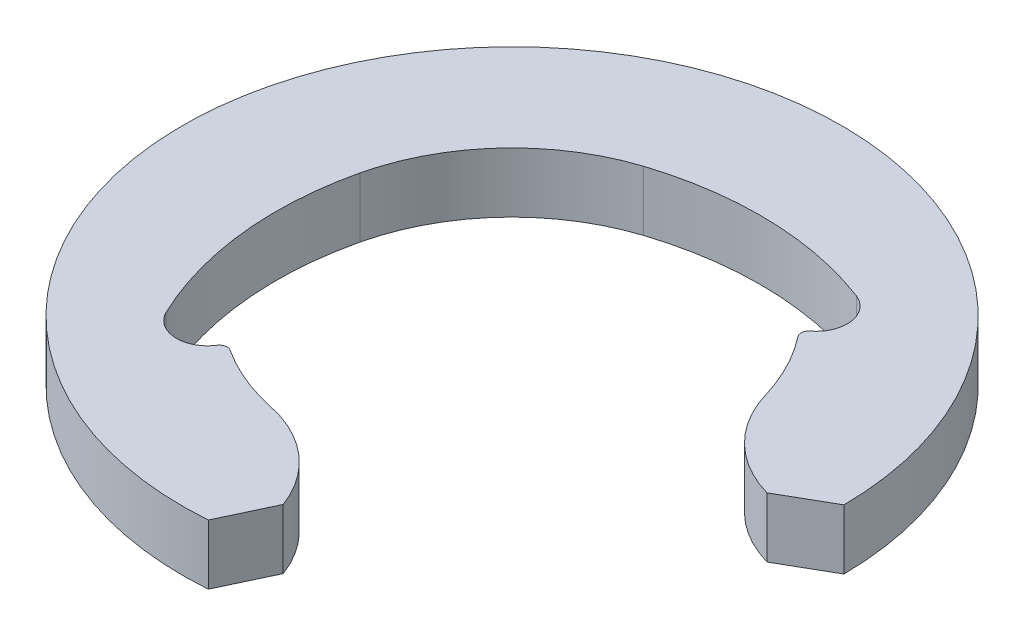
ISO-10303-21;
HEADER;
FILE_DESCRIPTION(('STEP AP214'),'2;1');
FILE_NAME('part.step','',(''),(''),'','','');
FILE_SCHEMA(('AUTOMOTIVE_DESIGN { 1 0 10303 214 1 1 1 1 }'));
ENDSEC;
DATA;
#1=APPLICATION_CONTEXT('core data for automotive mechanical design processes');
#2=APPLICATION_PROTOCOL_DEFINITION('international standard','automotive_design',2000,#1);
#3=PRODUCT_CONTEXT('',#1,'mechanical');
#4=PRODUCT('Part','Part','',(#3));
#5=PRODUCT_RELATED_PRODUCT_CATEGORY('part','',(#4));
#6=PRODUCT_DEFINITION_FORMATION('','',#4);
#7=PRODUCT_DEFINITION_CONTEXT('part definition',#1,'design');
#8=PRODUCT_DEFINITION('design','',#6,#7);
#9=PRODUCT_DEFINITION_SHAPE('','',#8);
#10=(LENGTH_UNIT() NAMED_UNIT(*) SI_UNIT(.MILLI.,.METRE.));
#11=(NAMED_UNIT(*) PLANE_ANGLE_UNIT() SI_UNIT($,.RADIAN.));
#12=(NAMED_UNIT(*) SI_UNIT($,.STERADIAN.) SOLID_ANGLE_UNIT());
#13=UNCERTAINTY_MEASURE_WITH_UNIT(LENGTH_MEASURE(1.E-05),#10,'distance_accuracy_value','');
#14=(GEOMETRIC_REPRESENTATION_CONTEXT(3) GLOBAL_UNCERTAINTY_ASSIGNED_CONTEXT((#13)) GLOBAL_UNIT_ASSIGNED_CONTEXT((#10,
#11,#12)) REPRESENTATION_CONTEXT('',''));
#15=CARTESIAN_POINT('',(0.,0.,0.));
#16=DIRECTION('',(0.,0.,1.));
#17=DIRECTION('',(1.,0.,0.));
#18=AXIS2_PLACEMENT_3D('',#15,#16,#17);
#19=CARTESIAN_POINT('',(1.06152361243118,-8.0264,-0.825318360032846));
#20=DIRECTION('',(0.,-1.,0.));
#21=DIRECTION('',(0.,0.,-1.));
#22=AXIS2_PLACEMENT_3D('',#19,#20,#21);
#23=PLANE('',#22);
#24=CARTESIAN_POINT('',(0.,-8.0264,0.));
#25=DIRECTION('',(0.,1.,0.));
#26=DIRECTION('',(0.,0.,1.));
#27=AXIS2_PLACEMENT_3D('',#24,#25,#26);
#28=CIRCLE('',#27,1.2954);
#29=CARTESIAN_POINT('',(1.2414363720262,-8.0264,-0.369995802963264));
#30=VERTEX_POINT('',#29);
#31=CARTESIAN_POINT('',(1.02267209887113,-8.0264,-0.795111902936013));
#32=VERTEX_POINT('',#31);
#33=EDGE_CURVE('E122',#30,#32,#28,.T.);
#34=ORIENTED_EDGE('',*,*,#33,.F.);
#35=CARTESIAN_POINT('',(1.99603495110095,-8.0264,-0.594895212607599));
#36=DIRECTION('',(0.,1.,0.));
#37=DIRECTION('',(0.,0.,1.));
#38=AXIS2_PLACEMENT_3D('',#35,#36,#37);
#39=CIRCLE('',#38,0.7874);
#40=CARTESIAN_POINT('',(1.78508296449176,-8.0264,0.163720644955132));
#41=VERTEX_POINT('',#40);
#42=EDGE_CURVE('E20',#41,#30,#39,.F.);
#43=ORIENTED_EDGE('',*,*,#42,.F.);
#44=DIRECTION('',(-0.867166283714379,0.,0.498018710882426));
#45=VECTOR('',#44,1.);
#46=CARTESIAN_POINT('',(2.09544966076299,-8.0264,-0.0145247791125125));
#47=LINE('',#46,#45);
#48=CARTESIAN_POINT('',(2.09544966076299,-8.0264,-0.0145247791125123));
#49=VERTEX_POINT('',#48);
#50=EDGE_CURVE('E115',#49,#41,#47,.T.);
#51=ORIENTED_EDGE('',*,*,#50,.F.);
#52=CARTESIAN_POINT('',(0.,-8.0264,0.));
#53=DIRECTION('',(0.,1.,0.));
#54=DIRECTION('',(0.,0.,1.));
#55=AXIS2_PLACEMENT_3D('',#52,#53,#54);
#56=CIRCLE('',#55,2.0955);
#57=CARTESIAN_POINT('',(0.15860830570357,-8.0264,2.08948885026024));
#58=VERTEX_POINT('',#57);
#59=EDGE_CURVE('E164',#58,#49,#56,.F.);
#60=ORIENTED_EDGE('',*,*,#59,.F.);
#61=DIRECTION('',(-0.424689236619047,0.,0.905339191850177));
#62=VECTOR('',#61,1.);
#63=CARTESIAN_POINT('',(0.310608444300769,-8.0264,1.76545972314077));
#64=LINE('',#63,#62);
#65=CARTESIAN_POINT('',(0.31060844430077,-8.0264,1.76545972314077));
#66=VERTEX_POINT('',#65);
#67=EDGE_CURVE('E168',#58,#66,#64,.F.);
#68=ORIENTED_EDGE('',*,*,#67,.T.);
#69=CARTESIAN_POINT('',(-0.427990513192639,-8.0264,2.03835226607598));
#70=DIRECTION('',(0.,1.,0.));
#71=DIRECTION('',(0.,0.,1.));
#72=AXIS2_PLACEMENT_3D('',#69,#70,#71);
#73=CIRCLE('',#72,0.7874);
#74=CARTESIAN_POINT('',(-0.266189221619812,-8.0264,1.2677556776814));
#75=VERTEX_POINT('',#74);
#76=EDGE_CURVE('E160',#75,#66,#73,.F.);
#77=ORIENTED_EDGE('',*,*,#76,.F.);
#78=CARTESIAN_POINT('',(0.,-8.0264,0.));
#79=DIRECTION('',(0.,1.,0.));
#80=DIRECTION('',(0.,0.,1.));
#81=AXIS2_PLACEMENT_3D('',#78,#79,#80);
#82=CIRCLE('',#81,1.2954);
#83=CARTESIAN_POINT('',(-0.707922475341271,-8.0264,1.08485341355719));
#84=VERTEX_POINT('',#83);
#85=EDGE_CURVE('E157',#75,#84,#82,.F.);
#86=ORIENTED_EDGE('',*,*,#85,.T.);
#87=CARTESIAN_POINT('',(-0.734816588987815,-8.0264,1.12606720745458));
#88=DIRECTION('',(0.,1.,0.));
#89=DIRECTION('',(0.,0.,1.));
#90=AXIS2_PLACEMENT_3D('',#87,#88,#89);
#91=CIRCLE('',#90,0.0492125);
#92=CARTESIAN_POINT('',(-0.77634065452485,-8.0264,1.0996546699482));
#93=VERTEX_POINT('',#92);
#94=EDGE_CURVE('E154',#93,#84,#91,.F.);
#95=ORIENTED_EDGE('',*,*,#94,.F.);
#96=CARTESIAN_POINT('',(-0.942436916672991,-8.0264,0.994004519922681));
#97=DIRECTION('',(0.,1.,0.));
#98=DIRECTION('',(0.,0.,1.));
#99=AXIS2_PLACEMENT_3D('',#96,#97,#98);
#100=CIRCLE('',#99,0.19685);
#101=CARTESIAN_POINT('',(-1.1199557561236,-8.0264,1.07907498565614));
#102=VERTEX_POINT('',#101);
#103=EDGE_CURVE('E151',#93,#102,#100,.F.);
#104=ORIENTED_EDGE('',*,*,#103,.T.);
#105=CARTESIAN_POINT('',(0.769760921899024,-8.0264,0.173486156880563));
#106=DIRECTION('',(0.,1.,0.));
#107=DIRECTION('',(0.,0.,1.));
#108=AXIS2_PLACEMENT_3D('',#105,#106,#107);
#109=CIRCLE('',#108,2.0955);
#110=CARTESIAN_POINT('',(-1.27075139620216,-8.0264,-0.303409774825023));
#111=VERTEX_POINT('',#110);
#112=EDGE_CURVE('E147',#102,#111,#109,.F.);
#113=ORIENTED_EDGE('',*,*,#112,.T.);
#114=CARTESIAN_POINT('',(-0.00934378137597372,-8.0264,-0.00860138067975123));
#115=DIRECTION('',(0.,1.,0.));
#116=DIRECTION('',(0.,0.,1.));
#117=AXIS2_PLACEMENT_3D('',#114,#115,#116);
#118=CIRCLE('',#117,1.2954);
#119=CARTESIAN_POINT('',(-0.407336611777588,-8.0264,-1.2413474481847));
#120=VERTEX_POINT('',#119);
#121=EDGE_CURVE('E143',#111,#120,#118,.F.);
#122=ORIENTED_EDGE('',*,*,#121,.T.);
#123=CARTESIAN_POINT('',(0.236475319754434,-8.0264,0.752800602190951));
#124=DIRECTION('',(0.,1.,0.));
#125=DIRECTION('',(0.,0.,1.));
#126=AXIS2_PLACEMENT_3D('',#123,#124,#125);
#127=CIRCLE('',#126,2.0955);
#128=CARTESIAN_POINT('',(0.98287960386645,-8.0264,-1.20525989091421));
#129=VERTEX_POINT('',#128);
#130=EDGE_CURVE('E139',#120,#129,#127,.F.);
#131=ORIENTED_EDGE('',*,*,#130,.T.);
#132=CARTESIAN_POINT('',(0.912762837783201,-8.0264,-1.02132087489524));
#133=DIRECTION('',(0.,1.,0.));
#134=DIRECTION('',(0.,0.,1.));
#135=AXIS2_PLACEMENT_3D('',#132,#133,#134);
#136=CIRCLE('',#135,0.19685);
#137=CARTESIAN_POINT('',(1.03177145750158,-8.0264,-0.864518863005325));
#138=VERTEX_POINT('',#137);
#139=EDGE_CURVE('E136',#129,#138,#136,.F.);
#140=ORIENTED_EDGE('',*,*,#139,.T.);
#141=CARTESIAN_POINT('',(1.06152361243118,-8.0264,-0.825318360032846));
#142=DIRECTION('',(0.,1.,0.));
#143=DIRECTION('',(0.,0.,1.));
#144=AXIS2_PLACEMENT_3D('',#141,#142,#143);
#145=CIRCLE('',#144,0.0492125);
#146=EDGE_CURVE('E131',#32,#138,#145,.F.);
#147=ORIENTED_EDGE('',*,*,#146,.F.);
#148=EDGE_LOOP('',(#34,#43,#51,#60,#68,#77,#86,#95,#104,#113,#122,#131,#140,#147));
#149=FACE_BOUND('',#148,.T.);
#150=ADVANCED_FACE('F17',(#149),#23,.F.);
#151=CARTESIAN_POINT('',(1.06152361243118,-8.4074,-0.825318360032846));
#152=DIRECTION('',(0.,1.,0.));
#153=DIRECTION('',(0.,0.,1.));
#154=AXIS2_PLACEMENT_3D('',#151,#152,#153);
#155=CYLINDRICAL_SURFACE('',#154,0.0492125);
#156=CARTESIAN_POINT('',(1.06152361243118,-8.4074,-0.825318360032846));
#157=DIRECTION('',(0.,1.,0.));
#158=DIRECTION('',(0.,0.,1.));
#159=AXIS2_PLACEMENT_3D('',#156,#157,#158);
#160=CIRCLE('',#159,0.0492125);
#161=CARTESIAN_POINT('',(1.02267209887113,-8.4074,-0.795111902936013));
#162=VERTEX_POINT('',#161);
#163=CARTESIAN_POINT('',(1.03177145750159,-8.4074,-0.864518863005324));
#164=VERTEX_POINT('',#163);
#165=EDGE_CURVE('E169',#162,#164,#160,.F.);
#166=ORIENTED_EDGE('',*,*,#165,.F.);
#167=DIRECTION('',(0.,1.,0.));
#168=VECTOR('',#167,1.);
#169=CARTESIAN_POINT('',(1.02267209887112,-8.4074,-0.795111902936014));
#170=LINE('',#169,#168);
#171=EDGE_CURVE('E128',#162,#32,#170,.T.);
#172=ORIENTED_EDGE('',*,*,#171,.T.);
#173=ORIENTED_EDGE('',*,*,#146,.T.);
#174=DIRECTION('',(0.,1.,0.));
#175=VECTOR('',#174,1.);
#176=CARTESIAN_POINT('',(1.03177145750158,-8.4074,-0.864518863005324));
#177=LINE('',#176,#175);
#178=EDGE_CURVE('E133',#138,#164,#177,.F.);
#179=ORIENTED_EDGE('',*,*,#178,.T.);
#180=EDGE_LOOP('',(#166,#172,#173,#179));
#181=FACE_BOUND('',#180,.T.);
#182=ADVANCED_FACE('F271',(#181),#155,.T.);
#183=CARTESIAN_POINT('',(0.912762837783201,-8.4074,-1.02132087489524));
#184=DIRECTION('',(0.,1.,0.));
#185=DIRECTION('',(0.,0.,1.));
#186=AXIS2_PLACEMENT_3D('',#183,#184,#185);
#187=CYLINDRICAL_SURFACE('',#186,0.19685);
#188=DIRECTION('',(0.,1.,0.));
#189=VECTOR('',#188,1.);
#190=CARTESIAN_POINT('',(0.98287960386645,-8.4074,-1.20525989091421));
#191=LINE('',#190,#189);
#192=CARTESIAN_POINT('',(0.982879603866451,-8.4074,-1.20525989091421));
#193=VERTEX_POINT('',#192);
#194=EDGE_CURVE('E138',#129,#193,#191,.F.);
#195=ORIENTED_EDGE('',*,*,#194,.T.);
#196=CARTESIAN_POINT('',(0.912762837783201,-8.4074,-1.02132087489524));
#197=DIRECTION('',(0.,1.,0.));
#198=DIRECTION('',(0.,0.,1.));
#199=AXIS2_PLACEMENT_3D('',#196,#197,#198);
#200=CIRCLE('',#199,0.19685);
#201=EDGE_CURVE('E172',#164,#193,#200,.T.);
#202=ORIENTED_EDGE('',*,*,#201,.F.);
#203=ORIENTED_EDGE('',*,*,#178,.F.);
#204=ORIENTED_EDGE('',*,*,#139,.F.);
#205=EDGE_LOOP('',(#195,#202,#203,#204));
#206=FACE_BOUND('',#205,.T.);
#207=ADVANCED_FACE('F268',(#206),#187,.F.);
#208=CARTESIAN_POINT('',(0.236475319754434,-8.4074,0.752800602190951));
#209=DIRECTION('',(0.,1.,0.));
#210=DIRECTION('',(0.,0.,1.));
#211=AXIS2_PLACEMENT_3D('',#208,#209,#210);
#212=CYLINDRICAL_SURFACE('',#211,2.0955);
#213=DIRECTION('',(0.,1.,0.));
#214=VECTOR('',#213,1.);
#215=CARTESIAN_POINT('',(-0.407336611777587,-8.4074,-1.2413474481847));
#216=LINE('',#215,#214);
#217=CARTESIAN_POINT('',(-0.407336611777587,-8.4074,-1.2413474481847));
#218=VERTEX_POINT('',#217);
#219=EDGE_CURVE('E142',#120,#218,#216,.F.);
#220=ORIENTED_EDGE('',*,*,#219,.T.);
#221=CARTESIAN_POINT('',(0.236475319754434,-8.4074,0.752800602190951));
#222=DIRECTION('',(0.,1.,0.));
#223=DIRECTION('',(0.,0.,1.));
#224=AXIS2_PLACEMENT_3D('',#221,#222,#223);
#225=CIRCLE('',#224,2.0955);
#226=EDGE_CURVE('E175',#193,#218,#225,.T.);
#227=ORIENTED_EDGE('',*,*,#226,.F.);
#228=ORIENTED_EDGE('',*,*,#194,.F.);
#229=ORIENTED_EDGE('',*,*,#130,.F.);
#230=EDGE_LOOP('',(#220,#227,#228,#229));
#231=FACE_BOUND('',#230,.T.);
#232=ADVANCED_FACE('F265',(#231),#212,.F.);
#233=CARTESIAN_POINT('',(-0.00934378137597374,-8.4074,-0.00860138067975115));
#234=DIRECTION('',(0.,1.,0.));
#235=DIRECTION('',(0.,0.,1.));
#236=AXIS2_PLACEMENT_3D('',#233,#234,#235);
#237=CYLINDRICAL_SURFACE('',#236,1.2954);
#238=DIRECTION('',(0.,1.,0.));
#239=VECTOR('',#238,1.);
#240=CARTESIAN_POINT('',(-1.27075139620216,-8.4074,-0.303409774825024));
#241=LINE('',#240,#239);
#242=CARTESIAN_POINT('',(-1.27075139620216,-8.4074,-0.303409774825023));
#243=VERTEX_POINT('',#242);
#244=EDGE_CURVE('E146',#111,#243,#241,.F.);
#245=ORIENTED_EDGE('',*,*,#244,.T.);
#246=CARTESIAN_POINT('',(-0.00934378137597374,-8.4074,-0.00860138067975115));
#247=DIRECTION('',(0.,1.,0.));
#248=DIRECTION('',(0.,0.,1.));
#249=AXIS2_PLACEMENT_3D('',#246,#247,#248);
#250=CIRCLE('',#249,1.2954);
#251=EDGE_CURVE('E178',#218,#243,#250,.T.);
#252=ORIENTED_EDGE('',*,*,#251,.F.);
#253=ORIENTED_EDGE('',*,*,#219,.F.);
#254=ORIENTED_EDGE('',*,*,#121,.F.);
#255=EDGE_LOOP('',(#245,#252,#253,#254));
#256=FACE_BOUND('',#255,.T.);
#257=ADVANCED_FACE('F262',(#256),#237,.F.);
#258=CARTESIAN_POINT('',(0.769760921899024,-8.4074,0.173486156880564));
#259=DIRECTION('',(0.,1.,0.));
#260=DIRECTION('',(0.,0.,1.));
#261=AXIS2_PLACEMENT_3D('',#258,#259,#260);
#262=CYLINDRICAL_SURFACE('',#261,2.0955);
#263=DIRECTION('',(0.,1.,0.));
#264=VECTOR('',#263,1.);
#265=CARTESIAN_POINT('',(-1.1199557561236,-8.4074,1.07907498565614));
#266=LINE('',#265,#264);
#267=CARTESIAN_POINT('',(-1.1199557561236,-8.4074,1.07907498565614));
#268=VERTEX_POINT('',#267);
#269=EDGE_CURVE('E150',#102,#268,#266,.F.);
#270=ORIENTED_EDGE('',*,*,#269,.T.);
#271=CARTESIAN_POINT('',(0.769760921899024,-8.4074,0.173486156880564));
#272=DIRECTION('',(0.,1.,0.));
#273=DIRECTION('',(0.,0.,1.));
#274=AXIS2_PLACEMENT_3D('',#271,#272,#273);
#275=CIRCLE('',#274,2.0955);
#276=EDGE_CURVE('E181',#243,#268,#275,.T.);
#277=ORIENTED_EDGE('',*,*,#276,.F.);
#278=ORIENTED_EDGE('',*,*,#244,.F.);
#279=ORIENTED_EDGE('',*,*,#112,.F.);
#280=EDGE_LOOP('',(#270,#277,#278,#279));
#281=FACE_BOUND('',#280,.T.);
#282=ADVANCED_FACE('F256',(#281),#262,.F.);
#283=CARTESIAN_POINT('',(-0.942436916672991,-8.4074,0.994004519922681));
#284=DIRECTION('',(0.,1.,0.));
#285=DIRECTION('',(0.,0.,1.));
#286=AXIS2_PLACEMENT_3D('',#283,#284,#285);
#287=CYLINDRICAL_SURFACE('',#286,0.19685);
#288=DIRECTION('',(0.,1.,0.));
#289=VECTOR('',#288,1.);
#290=CARTESIAN_POINT('',(-0.776340654524851,-8.4074,1.0996546699482));
#291=LINE('',#290,#289);
#292=CARTESIAN_POINT('',(-0.77634065452485,-8.4074,1.0996546699482));
#293=VERTEX_POINT('',#292);
#294=EDGE_CURVE('E156',#293,#93,#291,.T.);
#295=ORIENTED_EDGE('',*,*,#294,.F.);
#296=CARTESIAN_POINT('',(-0.942436916672991,-8.4074,0.994004519922681));
#297=DIRECTION('',(0.,1.,0.));
#298=DIRECTION('',(0.,0.,1.));
#299=AXIS2_PLACEMENT_3D('',#296,#297,#298);
#300=CIRCLE('',#299,0.19685);
#301=EDGE_CURVE('E184',#268,#293,#300,.T.);
#302=ORIENTED_EDGE('',*,*,#301,.F.);
#303=ORIENTED_EDGE('',*,*,#269,.F.);
#304=ORIENTED_EDGE('',*,*,#103,.F.);
#305=EDGE_LOOP('',(#295,#302,#303,#304));
#306=FACE_BOUND('',#305,.T.);
#307=ADVANCED_FACE('F252',(#306),#287,.F.);
#308=CARTESIAN_POINT('',(-0.734816588987815,-8.4074,1.12606720745458));
#309=DIRECTION('',(0.,1.,0.));
#310=DIRECTION('',(0.,0.,1.));
#311=AXIS2_PLACEMENT_3D('',#308,#309,#310);
#312=CYLINDRICAL_SURFACE('',#311,0.0492125);
#313=CARTESIAN_POINT('',(-0.734816588987815,-8.4074,1.12606720745458));
#314=DIRECTION('',(0.,1.,0.));
#315=DIRECTION('',(0.,0.,1.));
#316=AXIS2_PLACEMENT_3D('',#313,#314,#315);
#317=CIRCLE('',#316,0.0492125);
#318=CARTESIAN_POINT('',(-0.70792247534127,-8.4074,1.08485341355719));
#319=VERTEX_POINT('',#318);
#320=EDGE_CURVE('E187',#293,#319,#317,.F.);
#321=ORIENTED_EDGE('',*,*,#320,.F.);
#322=ORIENTED_EDGE('',*,*,#294,.T.);
#323=ORIENTED_EDGE('',*,*,#94,.T.);
#324=DIRECTION('',(0.,1.,0.));
#325=VECTOR('',#324,1.);
#326=CARTESIAN_POINT('',(-0.70792247534127,-8.4074,1.08485341355719));
#327=LINE('',#326,#325);
#328=EDGE_CURVE('E161',#84,#319,#327,.F.);
#329=ORIENTED_EDGE('',*,*,#328,.T.);
#330=EDGE_LOOP('',(#321,#322,#323,#329));
#331=FACE_BOUND('',#330,.T.);
#332=ADVANCED_FACE('F248',(#331),#312,.T.);
#333=CARTESIAN_POINT('',(0.,-8.4074,0.));
#334=DIRECTION('',(0.,1.,0.));
#335=DIRECTION('',(0.,0.,1.));
#336=AXIS2_PLACEMENT_3D('',#333,#334,#335);
#337=CYLINDRICAL_SURFACE('',#336,1.2954);
#338=DIRECTION('',(0.,1.,0.));
#339=VECTOR('',#338,1.);
#340=CARTESIAN_POINT('',(-0.266189221619813,-8.4074,1.2677556776814));
#341=LINE('',#340,#339);
#342=CARTESIAN_POINT('',(-0.266189221619812,-8.4074,1.2677556776814));
#343=VERTEX_POINT('',#342);
#344=EDGE_CURVE('E163',#343,#75,#341,.T.);
#345=ORIENTED_EDGE('',*,*,#344,.F.);
#346=CARTESIAN_POINT('',(0.,-8.4074,0.));
#347=DIRECTION('',(0.,1.,0.));
#348=DIRECTION('',(0.,0.,1.));
#349=AXIS2_PLACEMENT_3D('',#346,#347,#348);
#350=CIRCLE('',#349,1.2954);
#351=EDGE_CURVE('E190',#319,#343,#350,.T.);
#352=ORIENTED_EDGE('',*,*,#351,.F.);
#353=ORIENTED_EDGE('',*,*,#328,.F.);
#354=ORIENTED_EDGE('',*,*,#85,.F.);
#355=EDGE_LOOP('',(#345,#352,#353,#354));
#356=FACE_BOUND('',#355,.T.);
#357=ADVANCED_FACE('F244',(#356),#337,.F.);
#358=CARTESIAN_POINT('',(-0.427990513192639,-8.4074,2.03835226607598));
#359=DIRECTION('',(0.,1.,0.));
#360=DIRECTION('',(0.,0.,1.));
#361=AXIS2_PLACEMENT_3D('',#358,#359,#360);
#362=CYLINDRICAL_SURFACE('',#361,0.7874);
#363=CARTESIAN_POINT('',(-0.427990513192639,-8.4074,2.03835226607598));
#364=DIRECTION('',(0.,1.,0.));
#365=DIRECTION('',(0.,0.,1.));
#366=AXIS2_PLACEMENT_3D('',#363,#364,#365);
#367=CIRCLE('',#366,0.7874);
#368=CARTESIAN_POINT('',(0.31060844430077,-8.4074,1.76545972314077));
#369=VERTEX_POINT('',#368);
#370=EDGE_CURVE('E193',#343,#369,#367,.F.);
#371=ORIENTED_EDGE('',*,*,#370,.F.);
#372=ORIENTED_EDGE('',*,*,#344,.T.);
#373=ORIENTED_EDGE('',*,*,#76,.T.);
#374=DIRECTION('',(0.,1.,0.));
#375=VECTOR('',#374,1.);
#376=CARTESIAN_POINT('',(0.310608444300769,-8.4074,1.76545972314077));
#377=LINE('',#376,#375);
#378=EDGE_CURVE('E205',#66,#369,#377,.F.);
#379=ORIENTED_EDGE('',*,*,#378,.T.);
#380=EDGE_LOOP('',(#371,#372,#373,#379));
#381=FACE_BOUND('',#380,.T.);
#382=ADVANCED_FACE('F240',(#381),#362,.T.);
#383=CARTESIAN_POINT('',(0.310608444300769,-8.4074,1.76545972314077));
#384=DIRECTION('',(-0.905339191850177,0.,-0.424689236619047));
#385=DIRECTION('',(-0.424689236619047,0.,0.905339191850177));
#386=AXIS2_PLACEMENT_3D('',#383,#384,#385);
#387=PLANE('',#386);
#388=DIRECTION('',(0.,1.,0.));
#389=VECTOR('',#388,1.);
#390=CARTESIAN_POINT('',(0.15860830570357,-8.4074,2.08948885026024));
#391=LINE('',#390,#389);
#392=CARTESIAN_POINT('',(0.15860830570357,-8.4074,2.08948885026024));
#393=VERTEX_POINT('',#392);
#394=EDGE_CURVE('E167',#393,#58,#391,.T.);
#395=ORIENTED_EDGE('',*,*,#394,.F.);
#396=DIRECTION('',(-0.424689236619049,0.,0.905339191850176));
#397=VECTOR('',#396,1.);
#398=CARTESIAN_POINT('',(0.310608444300769,-8.4074,1.76545972314077));
#399=LINE('',#398,#397);
#400=EDGE_CURVE('E196',#369,#393,#399,.T.);
#401=ORIENTED_EDGE('',*,*,#400,.F.);
#402=ORIENTED_EDGE('',*,*,#378,.F.);
#403=ORIENTED_EDGE('',*,*,#67,.F.);
#404=EDGE_LOOP('',(#395,#401,#402,#403));
#405=FACE_BOUND('',#404,.T.);
#406=ADVANCED_FACE('F236',(#405),#387,.F.);
#407=CARTESIAN_POINT('',(0.,-8.4074,0.));
#408=DIRECTION('',(0.,1.,0.));
#409=DIRECTION('',(0.,0.,1.));
#410=AXIS2_PLACEMENT_3D('',#407,#408,#409);
#411=CYLINDRICAL_SURFACE('',#410,2.0955);
#412=CARTESIAN_POINT('',(0.,-8.4074,0.));
#413=DIRECTION('',(0.,1.,0.));
#414=DIRECTION('',(0.,0.,1.));
#415=AXIS2_PLACEMENT_3D('',#412,#413,#414);
#416=CIRCLE('',#415,2.0955);
#417=CARTESIAN_POINT('',(2.09544966076299,-8.4074,-0.0145247791125121));
#418=VERTEX_POINT('',#417);
#419=EDGE_CURVE('E197',#393,#418,#416,.F.);
#420=ORIENTED_EDGE('',*,*,#419,.F.);
#421=ORIENTED_EDGE('',*,*,#394,.T.);
#422=ORIENTED_EDGE('',*,*,#59,.T.);
#423=DIRECTION('',(0.,1.,0.));
#424=VECTOR('',#423,1.);
#425=CARTESIAN_POINT('',(2.09544966076299,-8.4074,-0.0145247791125112));
#426=LINE('',#425,#424);
#427=EDGE_CURVE('E219',#49,#418,#426,.F.);
#428=ORIENTED_EDGE('',*,*,#427,.T.);
#429=EDGE_LOOP('',(#420,#421,#422,#428));
#430=FACE_BOUND('',#429,.T.);
#431=ADVANCED_FACE('F232',(#430),#411,.T.);
#432=CARTESIAN_POINT('',(1.78508296449176,-8.4074,0.163720644955132));
#433=DIRECTION('',(-0.498018710882422,0.,-0.867166283714381));
#434=DIRECTION('',(-0.867166283714381,0.,0.498018710882422));
#435=AXIS2_PLACEMENT_3D('',#432,#433,#434);
#436=PLANE('',#435);
#437=DIRECTION('',(0.,1.,0.));
#438=VECTOR('',#437,1.);
#439=CARTESIAN_POINT('',(1.78508296449176,-8.4074,0.163720644955132));
#440=LINE('',#439,#438);
#441=CARTESIAN_POINT('',(1.78508296449176,-8.4074,0.163720644955132));
#442=VERTEX_POINT('',#441);
#443=EDGE_CURVE('E119',#442,#41,#440,.T.);
#444=ORIENTED_EDGE('',*,*,#443,.F.);
#445=DIRECTION('',(-0.867166283714379,0.,0.498018710882425));
#446=VECTOR('',#445,1.);
#447=CARTESIAN_POINT('',(2.09544966076299,-8.4074,-0.0145247791125124));
#448=LINE('',#447,#446);
#449=EDGE_CURVE('E200',#418,#442,#448,.T.);
#450=ORIENTED_EDGE('',*,*,#449,.F.);
#451=ORIENTED_EDGE('',*,*,#427,.F.);
#452=ORIENTED_EDGE('',*,*,#50,.T.);
#453=EDGE_LOOP('',(#444,#450,#451,#452));
#454=FACE_BOUND('',#453,.T.);
#455=ADVANCED_FACE('F230',(#454),#436,.F.);
#456=CARTESIAN_POINT('',(1.99603495110095,-8.4074,-0.594895212607599));
#457=DIRECTION('',(0.,1.,0.));
#458=DIRECTION('',(0.,0.,1.));
#459=AXIS2_PLACEMENT_3D('',#456,#457,#458);
#460=CYLINDRICAL_SURFACE('',#459,0.7874);
#461=CARTESIAN_POINT('',(1.99603495110095,-8.4074,-0.594895212607599));
#462=DIRECTION('',(0.,1.,0.));
#463=DIRECTION('',(0.,0.,1.));
#464=AXIS2_PLACEMENT_3D('',#461,#462,#463);
#465=CIRCLE('',#464,0.7874);
#466=CARTESIAN_POINT('',(1.2414363720262,-8.4074,-0.369995802963263));
#467=VERTEX_POINT('',#466);
#468=EDGE_CURVE('E26',#442,#467,#465,.F.);
#469=ORIENTED_EDGE('',*,*,#468,.F.);
#470=ORIENTED_EDGE('',*,*,#443,.T.);
#471=ORIENTED_EDGE('',*,*,#42,.T.);
#472=DIRECTION('',(0.,1.,0.));
#473=VECTOR('',#472,1.);
#474=CARTESIAN_POINT('',(1.2414363720262,-8.4074,-0.369995802963264));
#475=LINE('',#474,#473);
#476=EDGE_CURVE('E35',#30,#467,#475,.F.);
#477=ORIENTED_EDGE('',*,*,#476,.T.);
#478=EDGE_LOOP('',(#469,#470,#471,#477));
#479=FACE_BOUND('',#478,.T.);
#480=ADVANCED_FACE('F118',(#479),#460,.T.);
#481=CARTESIAN_POINT('',(0.,-8.4074,0.));
#482=DIRECTION('',(0.,1.,0.));
#483=DIRECTION('',(0.,0.,1.));
#484=AXIS2_PLACEMENT_3D('',#481,#482,#483);
#485=CYLINDRICAL_SURFACE('',#484,1.2954);
#486=ORIENTED_EDGE('',*,*,#171,.F.);
#487=CARTESIAN_POINT('',(0.,-8.4074,0.));
#488=DIRECTION('',(0.,1.,0.));
#489=DIRECTION('',(0.,0.,1.));
#490=AXIS2_PLACEMENT_3D('',#487,#488,#489);
#491=CIRCLE('',#490,1.2954);
#492=EDGE_CURVE('E11',#467,#162,#491,.T.);
#493=ORIENTED_EDGE('',*,*,#492,.F.);
#494=ORIENTED_EDGE('',*,*,#476,.F.);
#495=ORIENTED_EDGE('',*,*,#33,.T.);
#496=EDGE_LOOP('',(#486,#493,#494,#495));
#497=FACE_BOUND('',#496,.T.);
#498=ADVANCED_FACE('F125',(#497),#485,.F.);
#499=CARTESIAN_POINT('',(1.06152361243118,-8.4074,-0.825318360032846));
#500=DIRECTION('',(0.,-1.,0.));
#501=DIRECTION('',(0.,0.,-1.));
#502=AXIS2_PLACEMENT_3D('',#499,#500,#501);
#503=PLANE('',#502);
#504=ORIENTED_EDGE('',*,*,#468,.T.);
#505=ORIENTED_EDGE('',*,*,#492,.T.);
#506=ORIENTED_EDGE('',*,*,#165,.T.);
#507=ORIENTED_EDGE('',*,*,#201,.T.);
#508=ORIENTED_EDGE('',*,*,#226,.T.);
#509=ORIENTED_EDGE('',*,*,#251,.T.);
#510=ORIENTED_EDGE('',*,*,#276,.T.);
#511=ORIENTED_EDGE('',*,*,#301,.T.);
#512=ORIENTED_EDGE('',*,*,#320,.T.);
#513=ORIENTED_EDGE('',*,*,#351,.T.);
#514=ORIENTED_EDGE('',*,*,#370,.T.);
#515=ORIENTED_EDGE('',*,*,#400,.T.);
#516=ORIENTED_EDGE('',*,*,#419,.T.);
#517=ORIENTED_EDGE('',*,*,#449,.T.);
#518=EDGE_LOOP('',(#504,#505,#506,#507,#508,#509,#510,#511,#512,#513,#514,#515,#516,#517));
#519=FACE_BOUND('',#518,.T.);
#520=ADVANCED_FACE('F228',(#519),#503,.T.);
#521=CLOSED_SHELL('',(#150,#182,#207,#232,#257,#282,#307,#332,#357,#382,#406,#431,#455,#480,
#498,#520));
#522=MANIFOLD_SOLID_BREP('B1',#521);
#523=ADVANCED_BREP_SHAPE_REPRESENTATION('',(#18,#522),#14);
#524=SHAPE_DEFINITION_REPRESENTATION(#9,#523);
ENDSEC;
END-ISO-10303-21;
